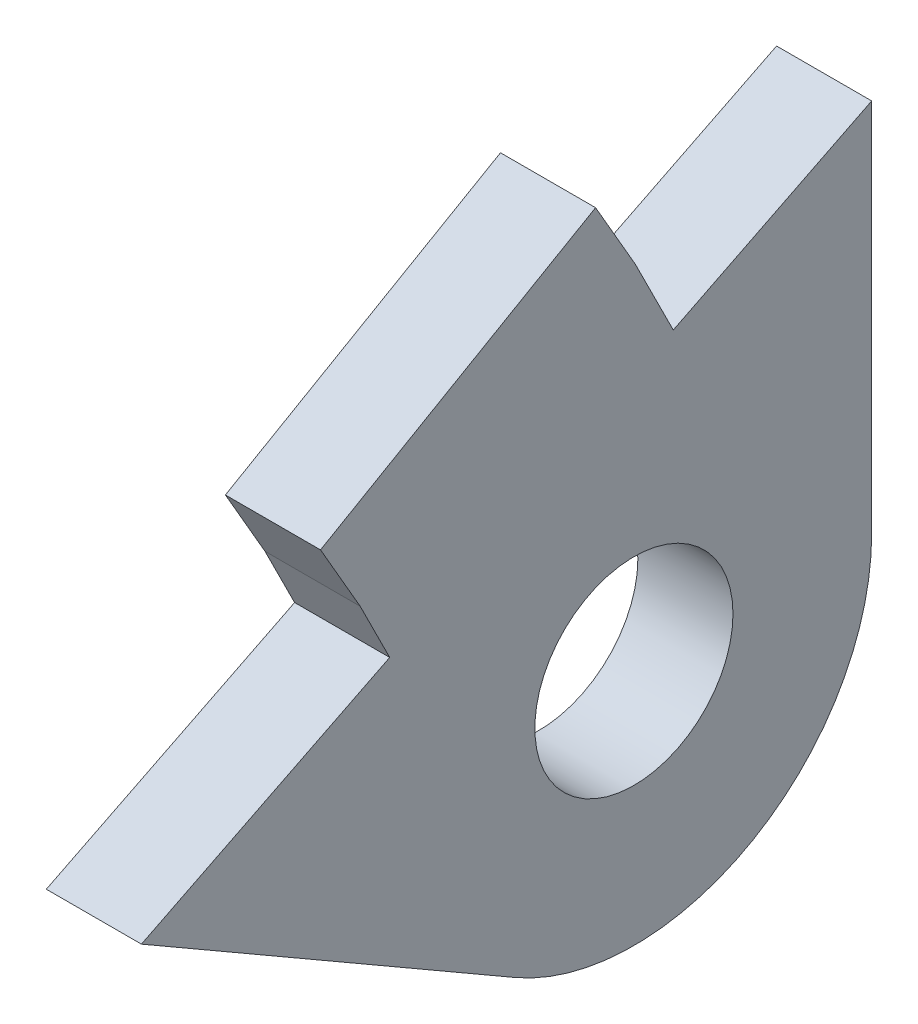
ISO-10303-21;
HEADER;
FILE_DESCRIPTION(('STEP AP214'),'2;1');
FILE_NAME('part.step','',(''),(''),'','','');
FILE_SCHEMA(('AUTOMOTIVE_DESIGN { 1 0 10303 214 1 1 1 1 }'));
ENDSEC;
DATA;
#1=APPLICATION_CONTEXT('core data for automotive mechanical design processes');
#2=APPLICATION_PROTOCOL_DEFINITION('international standard','automotive_design',2000,#1);
#3=PRODUCT_CONTEXT('',#1,'mechanical');
#4=PRODUCT('Part','Part','',(#3));
#5=PRODUCT_RELATED_PRODUCT_CATEGORY('part','',(#4));
#6=PRODUCT_DEFINITION_FORMATION('','',#4);
#7=PRODUCT_DEFINITION_CONTEXT('part definition',#1,'design');
#8=PRODUCT_DEFINITION('design','',#6,#7);
#9=PRODUCT_DEFINITION_SHAPE('','',#8);
#10=(LENGTH_UNIT() NAMED_UNIT(*) SI_UNIT(.MILLI.,.METRE.));
#11=(NAMED_UNIT(*) PLANE_ANGLE_UNIT() SI_UNIT($,.RADIAN.));
#12=(NAMED_UNIT(*) SI_UNIT($,.STERADIAN.) SOLID_ANGLE_UNIT());
#13=UNCERTAINTY_MEASURE_WITH_UNIT(LENGTH_MEASURE(1.E-05),#10,'distance_accuracy_value','');
#14=(GEOMETRIC_REPRESENTATION_CONTEXT(3) GLOBAL_UNCERTAINTY_ASSIGNED_CONTEXT((#13)) GLOBAL_UNIT_ASSIGNED_CONTEXT((#10,
#11,#12)) REPRESENTATION_CONTEXT('',''));
#15=CARTESIAN_POINT('',(0.,0.,0.));
#16=DIRECTION('',(0.,0.,1.));
#17=DIRECTION('',(1.,0.,0.));
#18=AXIS2_PLACEMENT_3D('',#15,#16,#17);
#19=CARTESIAN_POINT('',(41.,20.,-91.));
#20=DIRECTION('',(1.,0.,0.));
#21=DIRECTION('',(0.,0.,-1.));
#22=AXIS2_PLACEMENT_3D('',#19,#20,#21);
#23=PLANE('',#22);
#24=DIRECTION('',(0.,0.447213595499955,-0.894427190999917));
#25=VECTOR('',#24,1.);
#26=CARTESIAN_POINT('',(41.,37.3910905325809,-93.4847946212085));
#27=LINE('',#26,#25);
#28=CARTESIAN_POINT('',(41.,37.3910905325809,-93.4847946212085));
#29=VERTEX_POINT('',#28);
#30=CARTESIAN_POINT('',(41.,43.6486932219766,-106.));
#31=VERTEX_POINT('',#30);
#32=EDGE_CURVE('E144',#29,#31,#27,.T.);
#33=ORIENTED_EDGE('',*,*,#32,.F.);
#34=DIRECTION('',(0.,-0.894427190999917,-0.447213595499955));
#35=VECTOR('',#34,1.);
#36=CARTESIAN_POINT('',(41.,37.3910905325809,-93.4847946212085));
#37=LINE('',#36,#35);
#38=CARTESIAN_POINT('',(41.,42.1945322965477,-91.0830737392252));
#39=VERTEX_POINT('',#38);
#40=EDGE_CURVE('E153',#39,#29,#37,.T.);
#41=ORIENTED_EDGE('',*,*,#40,.F.);
#42=DIRECTION('',(0.,-0.866025403784439,-0.5));
#43=VECTOR('',#42,1.);
#44=CARTESIAN_POINT('',(41.,46.5246593154699,-88.5830737392252));
#45=LINE('',#44,#43);
#46=CARTESIAN_POINT('',(41.,46.5246593154699,-88.5830737392252));
#47=VERTEX_POINT('',#46);
#48=EDGE_CURVE('E122',#47,#39,#45,.T.);
#49=ORIENTED_EDGE('',*,*,#48,.F.);
#50=DIRECTION('',(0.,0.5,-0.866025403784438));
#51=VECTOR('',#50,1.);
#52=CARTESIAN_POINT('',(41.,36.506661651988,-71.2313927959682));
#53=LINE('',#52,#51);
#54=CARTESIAN_POINT('',(41.,36.506661651988,-71.2313927959682));
#55=VERTEX_POINT('',#54);
#56=EDGE_CURVE('E208',#55,#47,#53,.T.);
#57=ORIENTED_EDGE('',*,*,#56,.F.);
#58=DIRECTION('',(0.,-0.866025403784439,-0.5));
#59=VECTOR('',#58,1.);
#60=CARTESIAN_POINT('',(41.,36.506661651988,-71.2313927959682));
#61=LINE('',#60,#59);
#62=CARTESIAN_POINT('',(41.,32.1765346330658,-73.7313927959682));
#63=VERTEX_POINT('',#62);
#64=EDGE_CURVE('E136',#55,#63,#61,.T.);
#65=ORIENTED_EDGE('',*,*,#64,.T.);
#66=DIRECTION('',(0.,0.894427190999918,0.447213595499954));
#67=VECTOR('',#66,1.);
#68=CARTESIAN_POINT('',(41.,36.9695632446512,-71.3348784901755));
#69=LINE('',#68,#67);
#70=CARTESIAN_POINT('',(41.,28.4468186225818,-75.5962508012102));
#71=VERTEX_POINT('',#70);
#72=EDGE_CURVE('E150',#71,#63,#69,.T.);
#73=ORIENTED_EDGE('',*,*,#72,.F.);
#74=DIRECTION('',(0.,0.447213595499955,-0.894427190999917));
#75=VECTOR('',#74,1.);
#76=CARTESIAN_POINT('',(41.,-20.3038683956072,21.9051232351686));
#77=LINE('',#76,#75);
#78=CARTESIAN_POINT('',(41.,20.6155828423596,-59.9337792407657));
#79=VERTEX_POINT('',#78);
#80=EDGE_CURVE('E147',#79,#71,#77,.T.);
#81=ORIENTED_EDGE('',*,*,#80,.F.);
#82=DIRECTION('',(0.,-0.500000000000004,-0.866025403784436));
#83=VECTOR('',#82,1.);
#84=CARTESIAN_POINT('',(41.,7.00961894323346,-83.4999999999999));
#85=LINE('',#84,#83);
#86=CARTESIAN_POINT('',(41.,7.00961894323346,-83.4999999999999));
#87=VERTEX_POINT('',#86);
#88=EDGE_CURVE('E59',#79,#87,#85,.T.);
#89=ORIENTED_EDGE('',*,*,#88,.T.);
#90=CARTESIAN_POINT('',(41.,20.,-91.));
#91=DIRECTION('',(1.,0.,0.));
#92=DIRECTION('',(0.,0.,-1.));
#93=AXIS2_PLACEMENT_3D('',#90,#91,#92);
#94=CIRCLE('',#93,15.);
#95=CARTESIAN_POINT('',(41.,20.,-106.));
#96=VERTEX_POINT('',#95);
#97=EDGE_CURVE('E80',#87,#96,#94,.T.);
#98=ORIENTED_EDGE('',*,*,#97,.T.);
#99=DIRECTION('',(0.,1.,0.));
#100=VECTOR('',#99,1.);
#101=CARTESIAN_POINT('',(41.,50.8068236886879,-106.));
#102=LINE('',#101,#100);
#103=EDGE_CURVE('E170',#96,#31,#102,.T.);
#104=ORIENTED_EDGE('',*,*,#103,.T.);
#105=EDGE_LOOP('',(#33,#41,#49,#57,#65,#73,#81,#89,#98,#104));
#106=FACE_BOUND('',#105,.T.);
#107=CARTESIAN_POINT('',(41.,20.,-91.));
#108=DIRECTION('',(1.,0.,0.));
#109=DIRECTION('',(0.,0.,-1.));
#110=AXIS2_PLACEMENT_3D('',#107,#108,#109);
#111=CIRCLE('',#110,6.25);
#112=CARTESIAN_POINT('',(41.,20.,-97.25));
#113=VERTEX_POINT('',#112);
#114=EDGE_CURVE('E95',#113,#113,#111,.T.);
#115=ORIENTED_EDGE('',*,*,#114,.F.);
#116=EDGE_LOOP('',(#115));
#117=FACE_BOUND('',#116,.T.);
#118=ADVANCED_FACE('F35',(#106,#117),#23,.T.);
#119=CARTESIAN_POINT('',(35.,20.,-91.));
#120=DIRECTION('',(1.,0.,0.));
#121=DIRECTION('',(0.,0.,-1.));
#122=AXIS2_PLACEMENT_3D('',#119,#120,#121);
#123=PLANE('',#122);
#124=DIRECTION('',(0.,-0.894427190999917,-0.447213595499955));
#125=VECTOR('',#124,1.);
#126=CARTESIAN_POINT('',(35.,24.4721359549996,-99.9442719099992));
#127=LINE('',#126,#125);
#128=CARTESIAN_POINT('',(35.,42.1945322965477,-91.0830737392252));
#129=VERTEX_POINT('',#128);
#130=CARTESIAN_POINT('',(35.,37.3910905325809,-93.4847946212085));
#131=VERTEX_POINT('',#130);
#132=EDGE_CURVE('E130',#129,#131,#127,.T.);
#133=ORIENTED_EDGE('',*,*,#132,.T.);
#134=DIRECTION('',(0.,0.447213595499955,-0.894427190999917));
#135=VECTOR('',#134,1.);
#136=CARTESIAN_POINT('',(35.,32.9189545775814,-84.5405227112094));
#137=LINE('',#136,#135);
#138=CARTESIAN_POINT('',(35.,43.6486932219766,-106.));
#139=VERTEX_POINT('',#138);
#140=EDGE_CURVE('E166',#131,#139,#137,.T.);
#141=ORIENTED_EDGE('',*,*,#140,.T.);
#142=DIRECTION('',(0.,1.,0.));
#143=VECTOR('',#142,1.);
#144=CARTESIAN_POINT('',(35.,50.8068236886879,-106.));
#145=LINE('',#144,#143);
#146=CARTESIAN_POINT('',(35.,20.,-106.));
#147=VERTEX_POINT('',#146);
#148=EDGE_CURVE('E81',#147,#139,#145,.T.);
#149=ORIENTED_EDGE('',*,*,#148,.F.);
#150=CARTESIAN_POINT('',(35.,20.,-91.));
#151=DIRECTION('',(1.,0.,0.));
#152=DIRECTION('',(0.,0.,-1.));
#153=AXIS2_PLACEMENT_3D('',#150,#151,#152);
#154=CIRCLE('',#153,15.);
#155=CARTESIAN_POINT('',(35.,7.00961894323346,-83.4999999999999));
#156=VERTEX_POINT('',#155);
#157=EDGE_CURVE('E86',#156,#147,#154,.T.);
#158=ORIENTED_EDGE('',*,*,#157,.F.);
#159=DIRECTION('',(0.,-0.500000000000004,-0.866025403784436));
#160=VECTOR('',#159,1.);
#161=CARTESIAN_POINT('',(35.,7.00961894323346,-83.4999999999999));
#162=LINE('',#161,#160);
#163=CARTESIAN_POINT('',(35.,20.6155828423596,-59.9337792407657));
#164=VERTEX_POINT('',#163);
#165=EDGE_CURVE('E72',#164,#156,#162,.T.);
#166=ORIENTED_EDGE('',*,*,#165,.F.);
#167=DIRECTION('',(0.,0.447213595499955,-0.894427190999917));
#168=VECTOR('',#167,1.);
#169=CARTESIAN_POINT('',(35.,32.9189545775814,-84.5405227112094));
#170=LINE('',#169,#168);
#171=CARTESIAN_POINT('',(35.,28.4468186225818,-75.5962508012102));
#172=VERTEX_POINT('',#171);
#173=EDGE_CURVE('E50',#164,#172,#170,.T.);
#174=ORIENTED_EDGE('',*,*,#173,.T.);
#175=DIRECTION('',(0.,0.894427190999918,0.447213595499954));
#176=VECTOR('',#175,1.);
#177=CARTESIAN_POINT('',(35.,15.5278640450005,-82.0557280900008));
#178=LINE('',#177,#176);
#179=CARTESIAN_POINT('',(35.,32.1765346330658,-73.7313927959682));
#180=VERTEX_POINT('',#179);
#181=EDGE_CURVE('E162',#172,#180,#178,.T.);
#182=ORIENTED_EDGE('',*,*,#181,.T.);
#183=DIRECTION('',(0.,-0.866025403784439,-0.5));
#184=VECTOR('',#183,1.);
#185=CARTESIAN_POINT('',(35.,36.506661651988,-71.2313927959682));
#186=LINE('',#185,#184);
#187=CARTESIAN_POINT('',(35.,36.506661651988,-71.2313927959682));
#188=VERTEX_POINT('',#187);
#189=EDGE_CURVE('E134',#188,#180,#186,.T.);
#190=ORIENTED_EDGE('',*,*,#189,.F.);
#191=DIRECTION('',(0.,-0.5,0.866025403784438));
#192=VECTOR('',#191,1.);
#193=CARTESIAN_POINT('',(35.,46.5246593154699,-88.5830737392252));
#194=LINE('',#193,#192);
#195=CARTESIAN_POINT('',(35.,46.5246593154699,-88.5830737392252));
#196=VERTEX_POINT('',#195);
#197=EDGE_CURVE('E133',#196,#188,#194,.T.);
#198=ORIENTED_EDGE('',*,*,#197,.F.);
#199=DIRECTION('',(0.,-0.866025403784439,-0.5));
#200=VECTOR('',#199,1.);
#201=CARTESIAN_POINT('',(35.,46.5246593154699,-88.5830737392252));
#202=LINE('',#201,#200);
#203=EDGE_CURVE('E118',#196,#129,#202,.T.);
#204=ORIENTED_EDGE('',*,*,#203,.T.);
#205=EDGE_LOOP('',(#133,#141,#149,#158,#166,#174,#182,#190,#198,#204));
#206=FACE_BOUND('',#205,.T.);
#207=CARTESIAN_POINT('',(35.,20.,-91.));
#208=DIRECTION('',(1.,0.,0.));
#209=DIRECTION('',(0.,0.,-1.));
#210=AXIS2_PLACEMENT_3D('',#207,#208,#209);
#211=CIRCLE('',#210,6.25);
#212=CARTESIAN_POINT('',(35.,20.,-97.25));
#213=VERTEX_POINT('',#212);
#214=EDGE_CURVE('E99',#213,#213,#211,.T.);
#215=ORIENTED_EDGE('',*,*,#214,.T.);
#216=EDGE_LOOP('',(#215));
#217=FACE_BOUND('',#216,.T.);
#218=ADVANCED_FACE('F90',(#206,#217),#123,.F.);
#219=CARTESIAN_POINT('',(41.,20.,-91.));
#220=DIRECTION('',(-1.,0.,0.));
#221=DIRECTION('',(0.,0.,1.));
#222=AXIS2_PLACEMENT_3D('',#219,#220,#221);
#223=CYLINDRICAL_SURFACE('',#222,15.);
#224=ORIENTED_EDGE('',*,*,#157,.T.);
#225=DIRECTION('',(-1.,0.,0.));
#226=VECTOR('',#225,1.);
#227=CARTESIAN_POINT('',(41.,20.,-106.));
#228=LINE('',#227,#226);
#229=EDGE_CURVE('E87',#96,#147,#228,.T.);
#230=ORIENTED_EDGE('',*,*,#229,.F.);
#231=ORIENTED_EDGE('',*,*,#97,.F.);
#232=DIRECTION('',(-1.,0.,0.));
#233=VECTOR('',#232,1.);
#234=CARTESIAN_POINT('',(41.,7.00961894323346,-83.4999999999999));
#235=LINE('',#234,#233);
#236=EDGE_CURVE('E75',#87,#156,#235,.T.);
#237=ORIENTED_EDGE('',*,*,#236,.T.);
#238=EDGE_LOOP('',(#224,#230,#231,#237));
#239=FACE_BOUND('',#238,.T.);
#240=ADVANCED_FACE('F37',(#239),#223,.T.);
#241=CARTESIAN_POINT('',(41.,50.8068236886879,-106.));
#242=DIRECTION('',(0.,0.,1.));
#243=DIRECTION('',(1.,0.,0.));
#244=AXIS2_PLACEMENT_3D('',#241,#242,#243);
#245=PLANE('',#244);
#246=ORIENTED_EDGE('',*,*,#148,.T.);
#247=DIRECTION('',(1.,0.,0.));
#248=VECTOR('',#247,1.);
#249=CARTESIAN_POINT('',(41.,43.6486932219766,-106.));
#250=LINE('',#249,#248);
#251=EDGE_CURVE('E11',#139,#31,#250,.T.);
#252=ORIENTED_EDGE('',*,*,#251,.T.);
#253=ORIENTED_EDGE('',*,*,#103,.F.);
#254=ORIENTED_EDGE('',*,*,#229,.T.);
#255=EDGE_LOOP('',(#246,#252,#253,#254));
#256=FACE_BOUND('',#255,.T.);
#257=ADVANCED_FACE('F179',(#256),#245,.F.);
#258=CARTESIAN_POINT('',(41.,7.00961894323346,-83.4999999999999));
#259=DIRECTION('',(0.,0.866025403784436,-0.500000000000004));
#260=DIRECTION('',(0.,0.500000000000004,0.866025403784436));
#261=AXIS2_PLACEMENT_3D('',#258,#259,#260);
#262=PLANE('',#261);
#263=ORIENTED_EDGE('',*,*,#88,.F.);
#264=DIRECTION('',(-1.,0.,0.));
#265=VECTOR('',#264,1.);
#266=CARTESIAN_POINT('',(41.,20.6155828423596,-59.9337792407657));
#267=LINE('',#266,#265);
#268=EDGE_CURVE('E77',#79,#164,#267,.T.);
#269=ORIENTED_EDGE('',*,*,#268,.T.);
#270=ORIENTED_EDGE('',*,*,#165,.T.);
#271=ORIENTED_EDGE('',*,*,#236,.F.);
#272=EDGE_LOOP('',(#263,#269,#270,#271));
#273=FACE_BOUND('',#272,.T.);
#274=ADVANCED_FACE('F74',(#273),#262,.F.);
#275=CARTESIAN_POINT('',(41.,20.,-91.));
#276=DIRECTION('',(-1.,0.,0.));
#277=DIRECTION('',(0.,0.,1.));
#278=AXIS2_PLACEMENT_3D('',#275,#276,#277);
#279=CYLINDRICAL_SURFACE('',#278,6.25);
#280=ORIENTED_EDGE('',*,*,#114,.T.);
#281=EDGE_LOOP('',(#280));
#282=FACE_BOUND('',#281,.T.);
#283=ORIENTED_EDGE('',*,*,#214,.F.);
#284=EDGE_LOOP('',(#283));
#285=FACE_BOUND('',#284,.T.);
#286=ADVANCED_FACE('F225',(#282,#285),#279,.F.);
#287=CARTESIAN_POINT('',(31.,-20.3038683956072,21.9051232351686));
#288=DIRECTION('',(0.,-0.894427190999917,-0.447213595499955));
#289=DIRECTION('',(0.,0.447213595499955,-0.894427190999917));
#290=AXIS2_PLACEMENT_3D('',#287,#288,#289);
#291=PLANE('',#290);
#292=ORIENTED_EDGE('',*,*,#268,.F.);
#293=ORIENTED_EDGE('',*,*,#80,.T.);
#294=DIRECTION('',(1.,0.,0.));
#295=VECTOR('',#294,1.);
#296=CARTESIAN_POINT('',(31.,28.4468186225818,-75.5962508012102));
#297=LINE('',#296,#295);
#298=EDGE_CURVE('E155',#172,#71,#297,.T.);
#299=ORIENTED_EDGE('',*,*,#298,.F.);
#300=ORIENTED_EDGE('',*,*,#173,.F.);
#301=EDGE_LOOP('',(#292,#293,#299,#300));
#302=FACE_BOUND('',#301,.T.);
#303=ADVANCED_FACE('F223',(#302),#291,.F.);
#304=CARTESIAN_POINT('',(31.,36.9695632446512,-71.3348784901755));
#305=DIRECTION('',(0.,0.447213595499954,-0.894427190999918));
#306=DIRECTION('',(0.,0.894427190999918,0.447213595499954));
#307=AXIS2_PLACEMENT_3D('',#304,#305,#306);
#308=PLANE('',#307);
#309=ORIENTED_EDGE('',*,*,#298,.T.);
#310=ORIENTED_EDGE('',*,*,#72,.T.);
#311=DIRECTION('',(1.,0.,0.));
#312=VECTOR('',#311,1.);
#313=CARTESIAN_POINT('',(41.,32.1765346330658,-73.7313927959682));
#314=LINE('',#313,#312);
#315=EDGE_CURVE('E106',#180,#63,#314,.T.);
#316=ORIENTED_EDGE('',*,*,#315,.F.);
#317=ORIENTED_EDGE('',*,*,#181,.F.);
#318=EDGE_LOOP('',(#309,#310,#316,#317));
#319=FACE_BOUND('',#318,.T.);
#320=ADVANCED_FACE('F222',(#319),#308,.F.);
#321=CARTESIAN_POINT('',(31.,37.3910905325809,-93.4847946212085));
#322=DIRECTION('',(0.,-0.894427190999917,-0.447213595499955));
#323=DIRECTION('',(0.,0.447213595499955,-0.894427190999917));
#324=AXIS2_PLACEMENT_3D('',#321,#322,#323);
#325=PLANE('',#324);
#326=DIRECTION('',(1.,0.,0.));
#327=VECTOR('',#326,1.);
#328=CARTESIAN_POINT('',(31.,37.3910905325809,-93.4847946212085));
#329=LINE('',#328,#327);
#330=EDGE_CURVE('E156',#131,#29,#329,.T.);
#331=ORIENTED_EDGE('',*,*,#330,.T.);
#332=ORIENTED_EDGE('',*,*,#32,.T.);
#333=ORIENTED_EDGE('',*,*,#251,.F.);
#334=ORIENTED_EDGE('',*,*,#140,.F.);
#335=EDGE_LOOP('',(#331,#332,#333,#334));
#336=FACE_BOUND('',#335,.T.);
#337=ADVANCED_FACE('F183',(#336),#325,.F.);
#338=CARTESIAN_POINT('',(31.,37.3910905325809,-93.4847946212085));
#339=DIRECTION('',(0.,-0.447213595499955,0.894427190999917));
#340=DIRECTION('',(0.,-0.894427190999917,-0.447213595499955));
#341=AXIS2_PLACEMENT_3D('',#338,#339,#340);
#342=PLANE('',#341);
#343=DIRECTION('',(-1.,0.,0.));
#344=VECTOR('',#343,1.);
#345=CARTESIAN_POINT('',(41.,42.1945322965477,-91.0830737392252));
#346=LINE('',#345,#344);
#347=EDGE_CURVE('E43',#39,#129,#346,.T.);
#348=ORIENTED_EDGE('',*,*,#347,.F.);
#349=ORIENTED_EDGE('',*,*,#40,.T.);
#350=ORIENTED_EDGE('',*,*,#330,.F.);
#351=ORIENTED_EDGE('',*,*,#132,.F.);
#352=EDGE_LOOP('',(#348,#349,#350,#351));
#353=FACE_BOUND('',#352,.T.);
#354=ADVANCED_FACE('F291',(#353),#342,.F.);
#355=CARTESIAN_POINT('',(35.,36.506661651988,-71.2313927959682));
#356=DIRECTION('',(0.,0.5,-0.866025403784439));
#357=DIRECTION('',(0.,0.866025403784439,0.5));
#358=AXIS2_PLACEMENT_3D('',#355,#356,#357);
#359=PLANE('',#358);
#360=ORIENTED_EDGE('',*,*,#315,.T.);
#361=ORIENTED_EDGE('',*,*,#64,.F.);
#362=DIRECTION('',(1.,0.,0.));
#363=VECTOR('',#362,1.);
#364=CARTESIAN_POINT('',(35.,36.506661651988,-71.2313927959682));
#365=LINE('',#364,#363);
#366=EDGE_CURVE('E214',#188,#55,#365,.T.);
#367=ORIENTED_EDGE('',*,*,#366,.F.);
#368=ORIENTED_EDGE('',*,*,#189,.T.);
#369=EDGE_LOOP('',(#360,#361,#367,#368));
#370=FACE_BOUND('',#369,.T.);
#371=ADVANCED_FACE('F220',(#370),#359,.F.);
#372=CARTESIAN_POINT('',(41.,46.5246593154699,-88.5830737392252));
#373=DIRECTION('',(0.,-0.5,0.866025403784439));
#374=DIRECTION('',(0.,-0.866025403784439,-0.5));
#375=AXIS2_PLACEMENT_3D('',#372,#373,#374);
#376=PLANE('',#375);
#377=ORIENTED_EDGE('',*,*,#347,.T.);
#378=ORIENTED_EDGE('',*,*,#203,.F.);
#379=DIRECTION('',(-1.,0.,0.));
#380=VECTOR('',#379,1.);
#381=CARTESIAN_POINT('',(41.,46.5246593154699,-88.5830737392252));
#382=LINE('',#381,#380);
#383=EDGE_CURVE('E213',#47,#196,#382,.T.);
#384=ORIENTED_EDGE('',*,*,#383,.F.);
#385=ORIENTED_EDGE('',*,*,#48,.T.);
#386=EDGE_LOOP('',(#377,#378,#384,#385));
#387=FACE_BOUND('',#386,.T.);
#388=ADVANCED_FACE('F115',(#387),#376,.F.);
#389=CARTESIAN_POINT('',(0.,-3.4641016151372,-1.99999999999969));
#390=DIRECTION('',(0.,0.866025403784438,0.5));
#391=DIRECTION('',(0.,-0.5,0.866025403784438));
#392=AXIS2_PLACEMENT_3D('',#389,#390,#391);
#393=PLANE('',#392);
#394=ORIENTED_EDGE('',*,*,#366,.T.);
#395=ORIENTED_EDGE('',*,*,#56,.T.);
#396=ORIENTED_EDGE('',*,*,#383,.T.);
#397=ORIENTED_EDGE('',*,*,#197,.T.);
#398=EDGE_LOOP('',(#394,#395,#396,#397));
#399=FACE_BOUND('',#398,.T.);
#400=ADVANCED_FACE('F217',(#399),#393,.T.);
#401=CLOSED_SHELL('',(#118,#218,#240,#257,#274,#286,#303,#320,#337,#354,#371,#388,#400));
#402=MANIFOLD_SOLID_BREP('B2',#401);
#403=ADVANCED_BREP_SHAPE_REPRESENTATION('',(#18,#402),#14);
#404=SHAPE_DEFINITION_REPRESENTATION(#9,#403);
ENDSEC;
END-ISO-10303-21;
